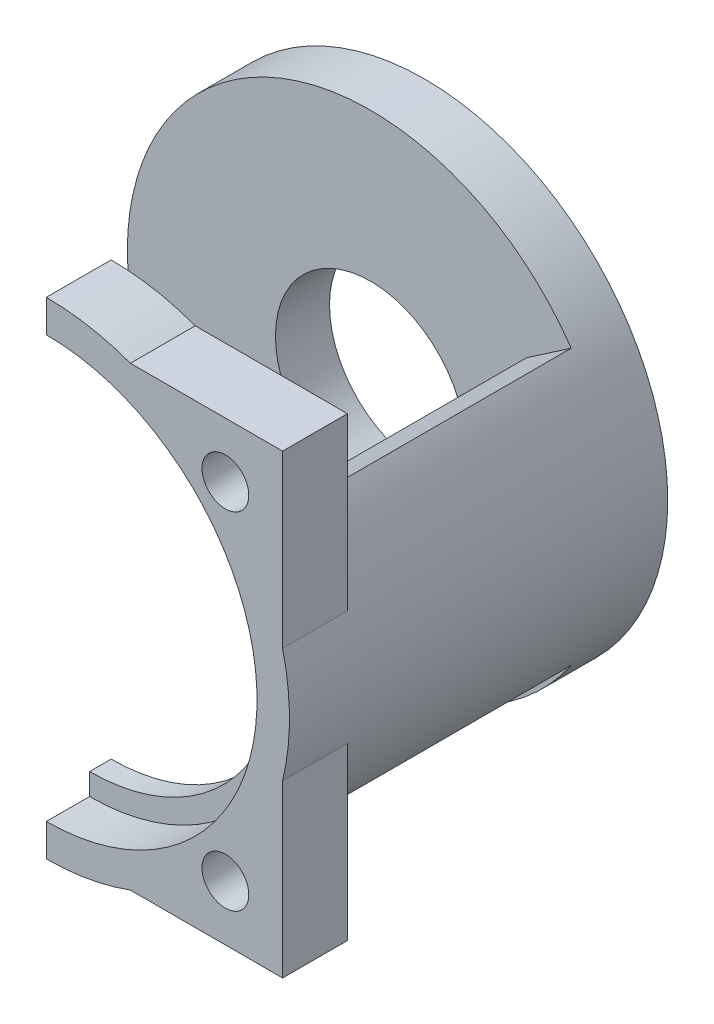
ISO-10303-21;
HEADER;
FILE_DESCRIPTION(('STEP AP214'),'2;1');
FILE_NAME('part.step','',(''),(''),'','','');
FILE_SCHEMA(('AUTOMOTIVE_DESIGN { 1 0 10303 214 1 1 1 1 }'));
ENDSEC;
DATA;
#1=APPLICATION_CONTEXT('core data for automotive mechanical design processes');
#2=APPLICATION_PROTOCOL_DEFINITION('international standard','automotive_design',2000,#1);
#3=PRODUCT_CONTEXT('',#1,'mechanical');
#4=PRODUCT('Part','Part','',(#3));
#5=PRODUCT_RELATED_PRODUCT_CATEGORY('part','',(#4));
#6=PRODUCT_DEFINITION_FORMATION('','',#4);
#7=PRODUCT_DEFINITION_CONTEXT('part definition',#1,'design');
#8=PRODUCT_DEFINITION('design','',#6,#7);
#9=PRODUCT_DEFINITION_SHAPE('','',#8);
#10=(LENGTH_UNIT() NAMED_UNIT(*) SI_UNIT(.MILLI.,.METRE.));
#11=(NAMED_UNIT(*) PLANE_ANGLE_UNIT() SI_UNIT($,.RADIAN.));
#12=(NAMED_UNIT(*) SI_UNIT($,.STERADIAN.) SOLID_ANGLE_UNIT());
#13=UNCERTAINTY_MEASURE_WITH_UNIT(LENGTH_MEASURE(1.E-05),#10,'distance_accuracy_value','');
#14=(GEOMETRIC_REPRESENTATION_CONTEXT(3) GLOBAL_UNCERTAINTY_ASSIGNED_CONTEXT((#13)) GLOBAL_UNIT_ASSIGNED_CONTEXT((#10,
#11,#12)) REPRESENTATION_CONTEXT('',''));
#15=CARTESIAN_POINT('',(0.,0.,0.));
#16=DIRECTION('',(0.,0.,1.));
#17=DIRECTION('',(1.,0.,0.));
#18=AXIS2_PLACEMENT_3D('',#15,#16,#17);
#19=CARTESIAN_POINT('',(0.,0.,0.));
#20=DIRECTION('',(0.,0.,1.));
#21=DIRECTION('',(1.,0.,0.));
#22=AXIS2_PLACEMENT_3D('',#19,#20,#21);
#23=PLANE('',#22);
#24=CARTESIAN_POINT('',(16.5717156908569,-16.,0.));
#25=DIRECTION('',(0.,0.,-1.));
#26=DIRECTION('',(-1.,0.,0.));
#27=AXIS2_PLACEMENT_3D('',#24,#25,#26);
#28=CIRCLE('',#27,2.165);
#29=CARTESIAN_POINT('',(14.4067156908569,-16.,0.));
#30=VERTEX_POINT('',#29);
#31=EDGE_CURVE('E286',#30,#30,#28,.T.);
#32=ORIENTED_EDGE('',*,*,#31,.F.);
#33=EDGE_LOOP('',(#32));
#34=FACE_BOUND('',#33,.T.);
#35=CARTESIAN_POINT('',(0.,0.,0.));
#36=DIRECTION('',(0.,0.,1.));
#37=DIRECTION('',(1.,0.,0.));
#38=AXIS2_PLACEMENT_3D('',#35,#36,#37);
#39=CIRCLE('',#38,22.4995417);
#40=CARTESIAN_POINT('',(0.,-22.4995417,0.));
#41=VERTEX_POINT('',#40);
#42=CARTESIAN_POINT('',(7.78357654700596,-21.11031295,0.));
#43=VERTEX_POINT('',#42);
#44=EDGE_CURVE('E174',#41,#43,#39,.T.);
#45=ORIENTED_EDGE('',*,*,#44,.F.);
#46=DIRECTION('',(0.,-1.,0.));
#47=VECTOR('',#46,1.);
#48=CARTESIAN_POINT('',(0.,20.4250061284432,0.));
#49=LINE('',#48,#47);
#50=CARTESIAN_POINT('',(0.,-17.4995417,0.));
#51=VERTEX_POINT('',#50);
#52=EDGE_CURVE('E167',#51,#41,#49,.T.);
#53=ORIENTED_EDGE('',*,*,#52,.F.);
#54=CARTESIAN_POINT('',(0.,0.,0.));
#55=DIRECTION('',(0.,0.,1.));
#56=DIRECTION('',(1.,0.,0.));
#57=AXIS2_PLACEMENT_3D('',#54,#55,#56);
#58=CIRCLE('',#57,17.4995417);
#59=CARTESIAN_POINT('',(14.4415275194375,-9.88312919147412,0.));
#60=VERTEX_POINT('',#59);
#61=EDGE_CURVE('E181',#51,#60,#58,.T.);
#62=ORIENTED_EDGE('',*,*,#61,.T.);
#63=DIRECTION('',(-0.82525175613242,0.564765029902133,0.));
#64=VECTOR('',#63,1.);
#65=CARTESIAN_POINT('',(14.4415275194375,-9.88312919147412,0.));
#66=LINE('',#65,#64);
#67=CARTESIAN_POINT('',(18.5677863000996,-12.7069543409848,0.));
#68=VERTEX_POINT('',#67);
#69=EDGE_CURVE('E244',#68,#60,#66,.T.);
#70=ORIENTED_EDGE('',*,*,#69,.F.);
#71=CARTESIAN_POINT('',(0.,0.,0.));
#72=DIRECTION('',(0.,0.,-1.));
#73=DIRECTION('',(-1.,0.,0.));
#74=AXIS2_PLACEMENT_3D('',#71,#72,#73);
#75=CIRCLE('',#74,22.4995417);
#76=CARTESIAN_POINT('',(21.8646315220259,-5.30728415633356,0.));
#77=VERTEX_POINT('',#76);
#78=EDGE_CURVE('E179',#77,#68,#75,.T.);
#79=ORIENTED_EDGE('',*,*,#78,.F.);
#80=DIRECTION('',(0.,-1.,0.));
#81=VECTOR('',#80,1.);
#82=CARTESIAN_POINT('',(21.8646315220259,-21.11031295,0.));
#83=LINE('',#82,#81);
#84=CARTESIAN_POINT('',(21.8646315220259,-21.11031295,0.));
#85=VERTEX_POINT('',#84);
#86=EDGE_CURVE('E216',#77,#85,#83,.T.);
#87=ORIENTED_EDGE('',*,*,#86,.T.);
#88=DIRECTION('',(-1.,0.,0.));
#89=VECTOR('',#88,1.);
#90=CARTESIAN_POINT('',(7.78357654700597,-21.11031295,0.));
#91=LINE('',#90,#89);
#92=EDGE_CURVE('E220',#85,#43,#91,.T.);
#93=ORIENTED_EDGE('',*,*,#92,.T.);
#94=EDGE_LOOP('',(#45,#53,#62,#70,#79,#87,#93));
#95=FACE_BOUND('',#94,.T.);
#96=ADVANCED_FACE('F36',(#34,#95),#23,.F.);
#97=CARTESIAN_POINT('',(16.5717156908569,16.,0.));
#98=DIRECTION('',(0.,0.,-1.));
#99=DIRECTION('',(-1.,0.,0.));
#100=AXIS2_PLACEMENT_3D('',#97,#98,#99);
#101=CIRCLE('',#100,2.165);
#102=CARTESIAN_POINT('',(14.4067156908569,16.,0.));
#103=VERTEX_POINT('',#102);
#104=EDGE_CURVE('E280',#103,#103,#101,.T.);
#105=ORIENTED_EDGE('',*,*,#104,.F.);
#106=EDGE_LOOP('',(#105));
#107=FACE_BOUND('',#106,.T.);
#108=CARTESIAN_POINT('',(14.4415275194375,9.88312919147413,0.));
#109=VERTEX_POINT('',#108);
#110=CARTESIAN_POINT('',(0.,17.4995417,0.));
#111=VERTEX_POINT('',#110);
#112=EDGE_CURVE('E165',#109,#111,#58,.T.);
#113=ORIENTED_EDGE('',*,*,#112,.T.);
#114=CARTESIAN_POINT('',(0.,22.4995417,0.));
#115=VERTEX_POINT('',#114);
#116=EDGE_CURVE('E149',#115,#111,#49,.T.);
#117=ORIENTED_EDGE('',*,*,#116,.F.);
#118=CARTESIAN_POINT('',(7.78357654700599,21.11031295,0.));
#119=VERTEX_POINT('',#118);
#120=EDGE_CURVE('E162',#119,#115,#39,.T.);
#121=ORIENTED_EDGE('',*,*,#120,.F.);
#122=DIRECTION('',(1.,0.,0.));
#123=VECTOR('',#122,1.);
#124=CARTESIAN_POINT('',(7.78357654700599,21.11031295,0.));
#125=LINE('',#124,#123);
#126=CARTESIAN_POINT('',(21.8646315220259,21.11031295,0.));
#127=VERTEX_POINT('',#126);
#128=EDGE_CURVE('E197',#119,#127,#125,.T.);
#129=ORIENTED_EDGE('',*,*,#128,.T.);
#130=DIRECTION('',(0.,-1.,0.));
#131=VECTOR('',#130,1.);
#132=CARTESIAN_POINT('',(21.8646315220259,5.30728415633356,0.));
#133=LINE('',#132,#131);
#134=CARTESIAN_POINT('',(21.8646315220259,5.30728415633356,0.));
#135=VERTEX_POINT('',#134);
#136=EDGE_CURVE('E200',#127,#135,#133,.T.);
#137=ORIENTED_EDGE('',*,*,#136,.T.);
#138=CARTESIAN_POINT('',(18.5677863000996,12.7069543409848,0.));
#139=VERTEX_POINT('',#138);
#140=EDGE_CURVE('E247',#139,#135,#75,.T.);
#141=ORIENTED_EDGE('',*,*,#140,.F.);
#142=DIRECTION('',(0.82525175613242,0.564765029902133,0.));
#143=VECTOR('',#142,1.);
#144=CARTESIAN_POINT('',(14.4415275194375,9.88312919147413,0.));
#145=LINE('',#144,#143);
#146=EDGE_CURVE('E240',#109,#139,#145,.T.);
#147=ORIENTED_EDGE('',*,*,#146,.F.);
#148=EDGE_LOOP('',(#113,#117,#121,#129,#137,#141,#147));
#149=FACE_BOUND('',#148,.T.);
#150=ADVANCED_FACE('F160',(#107,#149),#23,.F.);
#151=CARTESIAN_POINT('',(0.,0.,6.));
#152=DIRECTION('',(0.,0.,-1.));
#153=DIRECTION('',(-1.,0.,0.));
#154=AXIS2_PLACEMENT_3D('',#151,#152,#153);
#155=CYLINDRICAL_SURFACE('',#154,22.4995417);
#156=CARTESIAN_POINT('',(0.,0.,6.));
#157=DIRECTION('',(0.,0.,1.));
#158=DIRECTION('',(1.,0.,0.));
#159=AXIS2_PLACEMENT_3D('',#156,#157,#158);
#160=CIRCLE('',#159,22.4995417);
#161=CARTESIAN_POINT('',(0.,-22.4995417,6.));
#162=VERTEX_POINT('',#161);
#163=CARTESIAN_POINT('',(7.78357654700596,-21.11031295,6.));
#164=VERTEX_POINT('',#163);
#165=EDGE_CURVE('E175',#162,#164,#160,.T.);
#166=ORIENTED_EDGE('',*,*,#165,.F.);
#167=DIRECTION('',(0.,0.,-1.));
#168=VECTOR('',#167,1.);
#169=CARTESIAN_POINT('',(0.,-22.4995417,6.));
#170=LINE('',#169,#168);
#171=EDGE_CURVE('E155',#162,#41,#170,.T.);
#172=ORIENTED_EDGE('',*,*,#171,.T.);
#173=ORIENTED_EDGE('',*,*,#44,.T.);
#174=DIRECTION('',(0.,0.,-1.));
#175=VECTOR('',#174,1.);
#176=CARTESIAN_POINT('',(7.78357654700597,-21.11031295,6.));
#177=LINE('',#176,#175);
#178=EDGE_CURVE('E208',#164,#43,#177,.T.);
#179=ORIENTED_EDGE('',*,*,#178,.F.);
#180=EDGE_LOOP('',(#166,#172,#173,#179));
#181=FACE_BOUND('',#180,.T.);
#182=ADVANCED_FACE('F312',(#181),#155,.T.);
#183=ORIENTED_EDGE('',*,*,#120,.T.);
#184=DIRECTION('',(0.,0.,-1.));
#185=VECTOR('',#184,1.);
#186=CARTESIAN_POINT('',(0.,22.4995417,6.));
#187=LINE('',#186,#185);
#188=CARTESIAN_POINT('',(0.,22.4995417,6.));
#189=VERTEX_POINT('',#188);
#190=EDGE_CURVE('E146',#115,#189,#187,.F.);
#191=ORIENTED_EDGE('',*,*,#190,.T.);
#192=CARTESIAN_POINT('',(7.78357654700599,21.11031295,6.));
#193=VERTEX_POINT('',#192);
#194=EDGE_CURVE('E177',#193,#189,#160,.T.);
#195=ORIENTED_EDGE('',*,*,#194,.F.);
#196=DIRECTION('',(0.,0.,-1.));
#197=VECTOR('',#196,1.);
#198=CARTESIAN_POINT('',(7.78357654700599,21.11031295,6.));
#199=LINE('',#198,#197);
#200=EDGE_CURVE('E171',#193,#119,#199,.T.);
#201=ORIENTED_EDGE('',*,*,#200,.T.);
#202=EDGE_LOOP('',(#183,#191,#195,#201));
#203=FACE_BOUND('',#202,.T.);
#204=ADVANCED_FACE('F169',(#203),#155,.T.);
#205=CARTESIAN_POINT('',(0.,0.,6.));
#206=DIRECTION('',(0.,0.,-1.));
#207=DIRECTION('',(-1.,0.,0.));
#208=AXIS2_PLACEMENT_3D('',#205,#206,#207);
#209=CYLINDRICAL_SURFACE('',#208,17.4995417);
#210=DIRECTION('',(0.,0.,-1.));
#211=VECTOR('',#210,1.);
#212=CARTESIAN_POINT('',(0.,-17.4995417,6.));
#213=LINE('',#212,#211);
#214=CARTESIAN_POINT('',(0.,-17.4995417,2.));
#215=VERTEX_POINT('',#214);
#216=EDGE_CURVE('E156',#215,#51,#213,.T.);
#217=ORIENTED_EDGE('',*,*,#216,.F.);
#218=CARTESIAN_POINT('',(0.,0.,2.));
#219=DIRECTION('',(0.,0.,1.));
#220=DIRECTION('',(1.,0.,0.));
#221=AXIS2_PLACEMENT_3D('',#218,#219,#220);
#222=CIRCLE('',#221,17.4995417);
#223=CARTESIAN_POINT('',(0.,17.4995417,2.));
#224=VERTEX_POINT('',#223);
#225=EDGE_CURVE('E186',#215,#224,#222,.T.);
#226=ORIENTED_EDGE('',*,*,#225,.T.);
#227=DIRECTION('',(0.,0.,-1.));
#228=VECTOR('',#227,1.);
#229=CARTESIAN_POINT('',(0.,17.4995417,6.));
#230=LINE('',#229,#228);
#231=EDGE_CURVE('E58',#111,#224,#230,.F.);
#232=ORIENTED_EDGE('',*,*,#231,.F.);
#233=ORIENTED_EDGE('',*,*,#112,.F.);
#234=DIRECTION('',(0.,0.,1.));
#235=VECTOR('',#234,1.);
#236=CARTESIAN_POINT('',(14.4415275194375,9.88312919147412,-24.));
#237=LINE('',#236,#235);
#238=CARTESIAN_POINT('',(14.4415275194375,9.88312919147412,-24.));
#239=VERTEX_POINT('',#238);
#240=EDGE_CURVE('E233',#239,#109,#237,.T.);
#241=ORIENTED_EDGE('',*,*,#240,.F.);
#242=CARTESIAN_POINT('',(0.,0.,-24.));
#243=DIRECTION('',(0.,0.,1.));
#244=DIRECTION('',(-1.,0.,0.));
#245=AXIS2_PLACEMENT_3D('',#242,#243,#244);
#246=CIRCLE('',#245,17.4995417);
#247=CARTESIAN_POINT('',(14.4415275194375,-9.88312919147412,-24.));
#248=VERTEX_POINT('',#247);
#249=EDGE_CURVE('E253',#248,#239,#246,.T.);
#250=ORIENTED_EDGE('',*,*,#249,.F.);
#251=DIRECTION('',(0.,0.,1.));
#252=VECTOR('',#251,1.);
#253=CARTESIAN_POINT('',(14.4415275194375,-9.88312919147412,-24.));
#254=LINE('',#253,#252);
#255=EDGE_CURVE('E230',#248,#60,#254,.T.);
#256=ORIENTED_EDGE('',*,*,#255,.T.);
#257=ORIENTED_EDGE('',*,*,#61,.F.);
#258=EDGE_LOOP('',(#217,#226,#232,#233,#241,#250,#256,#257));
#259=FACE_BOUND('',#258,.T.);
#260=ADVANCED_FACE('F341',(#259),#209,.F.);
#261=CARTESIAN_POINT('',(0.,0.,6.));
#262=DIRECTION('',(0.,0.,1.));
#263=DIRECTION('',(1.,0.,0.));
#264=AXIS2_PLACEMENT_3D('',#261,#262,#263);
#265=PLANE('',#264);
#266=CARTESIAN_POINT('',(16.5717156908569,16.,6.));
#267=DIRECTION('',(0.,0.,-1.));
#268=DIRECTION('',(-1.,0.,0.));
#269=AXIS2_PLACEMENT_3D('',#266,#267,#268);
#270=CIRCLE('',#269,2.165);
#271=CARTESIAN_POINT('',(14.4067156908569,16.,6.));
#272=VERTEX_POINT('',#271);
#273=EDGE_CURVE('E283',#272,#272,#270,.T.);
#274=ORIENTED_EDGE('',*,*,#273,.T.);
#275=EDGE_LOOP('',(#274));
#276=FACE_BOUND('',#275,.T.);
#277=CARTESIAN_POINT('',(16.5717156908569,-16.,6.));
#278=DIRECTION('',(0.,0.,-1.));
#279=DIRECTION('',(-1.,0.,0.));
#280=AXIS2_PLACEMENT_3D('',#277,#278,#279);
#281=CIRCLE('',#280,2.165);
#282=CARTESIAN_POINT('',(14.4067156908569,-16.,6.));
#283=VERTEX_POINT('',#282);
#284=EDGE_CURVE('E277',#283,#283,#281,.T.);
#285=ORIENTED_EDGE('',*,*,#284,.T.);
#286=EDGE_LOOP('',(#285));
#287=FACE_BOUND('',#286,.T.);
#288=DIRECTION('',(0.,-1.,0.));
#289=VECTOR('',#288,1.);
#290=CARTESIAN_POINT('',(0.,20.4250061284432,6.));
#291=LINE('',#290,#289);
#292=CARTESIAN_POINT('',(0.,-19.4995417,6.));
#293=VERTEX_POINT('',#292);
#294=EDGE_CURVE('E166',#293,#162,#291,.T.);
#295=ORIENTED_EDGE('',*,*,#294,.T.);
#296=ORIENTED_EDGE('',*,*,#165,.T.);
#297=DIRECTION('',(-1.,0.,0.));
#298=VECTOR('',#297,1.);
#299=CARTESIAN_POINT('',(7.78357654700597,-21.11031295,6.));
#300=LINE('',#299,#298);
#301=CARTESIAN_POINT('',(21.8646315220259,-21.11031295,6.));
#302=VERTEX_POINT('',#301);
#303=EDGE_CURVE('E219',#302,#164,#300,.T.);
#304=ORIENTED_EDGE('',*,*,#303,.F.);
#305=DIRECTION('',(0.,-1.,0.));
#306=VECTOR('',#305,1.);
#307=CARTESIAN_POINT('',(21.8646315220259,-21.11031295,6.));
#308=LINE('',#307,#306);
#309=CARTESIAN_POINT('',(21.8646315220259,-5.30728415633356,6.));
#310=VERTEX_POINT('',#309);
#311=EDGE_CURVE('E212',#310,#302,#308,.T.);
#312=ORIENTED_EDGE('',*,*,#311,.F.);
#313=CARTESIAN_POINT('',(21.8646315220259,5.30728415633356,6.));
#314=VERTEX_POINT('',#313);
#315=EDGE_CURVE('E173',#310,#314,#160,.T.);
#316=ORIENTED_EDGE('',*,*,#315,.T.);
#317=DIRECTION('',(0.,-1.,0.));
#318=VECTOR('',#317,1.);
#319=CARTESIAN_POINT('',(21.8646315220259,5.30728415633356,6.));
#320=LINE('',#319,#318);
#321=CARTESIAN_POINT('',(21.8646315220259,21.11031295,6.));
#322=VERTEX_POINT('',#321);
#323=EDGE_CURVE('E199',#322,#314,#320,.T.);
#324=ORIENTED_EDGE('',*,*,#323,.F.);
#325=DIRECTION('',(1.,0.,0.));
#326=VECTOR('',#325,1.);
#327=CARTESIAN_POINT('',(7.78357654700599,21.11031295,6.));
#328=LINE('',#327,#326);
#329=EDGE_CURVE('E194',#193,#322,#328,.T.);
#330=ORIENTED_EDGE('',*,*,#329,.F.);
#331=ORIENTED_EDGE('',*,*,#194,.T.);
#332=CARTESIAN_POINT('',(0.,19.4995417,6.));
#333=VERTEX_POINT('',#332);
#334=EDGE_CURVE('E151',#189,#333,#291,.T.);
#335=ORIENTED_EDGE('',*,*,#334,.T.);
#336=CARTESIAN_POINT('',(0.,0.,6.));
#337=DIRECTION('',(0.,0.,1.));
#338=DIRECTION('',(1.,0.,0.));
#339=AXIS2_PLACEMENT_3D('',#336,#337,#338);
#340=CIRCLE('',#339,19.4995417);
#341=EDGE_CURVE('E182',#293,#333,#340,.T.);
#342=ORIENTED_EDGE('',*,*,#341,.F.);
#343=EDGE_LOOP('',(#295,#296,#304,#312,#316,#324,#330,#331,#335,#342));
#344=FACE_BOUND('',#343,.T.);
#345=ADVANCED_FACE('F292',(#276,#287,#344),#265,.T.);
#346=ORIENTED_EDGE('',*,*,#315,.F.);
#347=DIRECTION('',(0.,0.,-1.));
#348=VECTOR('',#347,1.);
#349=CARTESIAN_POINT('',(21.8646315220259,-5.30728415633356,6.));
#350=LINE('',#349,#348);
#351=EDGE_CURVE('E211',#310,#77,#350,.T.);
#352=ORIENTED_EDGE('',*,*,#351,.T.);
#353=ORIENTED_EDGE('',*,*,#78,.T.);
#354=DIRECTION('',(0.,0.,1.));
#355=VECTOR('',#354,1.);
#356=CARTESIAN_POINT('',(18.5677863000996,-12.7069543409848,-24.));
#357=LINE('',#356,#355);
#358=CARTESIAN_POINT('',(18.5677863000996,-12.7069543409848,-24.));
#359=VERTEX_POINT('',#358);
#360=EDGE_CURVE('E223',#359,#68,#357,.T.);
#361=ORIENTED_EDGE('',*,*,#360,.F.);
#362=CARTESIAN_POINT('',(0.,0.,-24.));
#363=DIRECTION('',(0.,0.,-1.));
#364=DIRECTION('',(-1.,0.,0.));
#365=AXIS2_PLACEMENT_3D('',#362,#363,#364);
#366=CIRCLE('',#365,22.4995417);
#367=CARTESIAN_POINT('',(18.5677863000996,12.7069543409848,-24.));
#368=VERTEX_POINT('',#367);
#369=EDGE_CURVE('E258',#359,#368,#366,.T.);
#370=ORIENTED_EDGE('',*,*,#369,.T.);
#371=DIRECTION('',(0.,0.,1.));
#372=VECTOR('',#371,1.);
#373=CARTESIAN_POINT('',(18.5677863000996,12.7069543409848,-24.));
#374=LINE('',#373,#372);
#375=EDGE_CURVE('E236',#368,#139,#374,.T.);
#376=ORIENTED_EDGE('',*,*,#375,.T.);
#377=ORIENTED_EDGE('',*,*,#140,.T.);
#378=DIRECTION('',(0.,0.,-1.));
#379=VECTOR('',#378,1.);
#380=CARTESIAN_POINT('',(21.8646315220259,5.30728415633356,6.));
#381=LINE('',#380,#379);
#382=EDGE_CURVE('E192',#314,#135,#381,.T.);
#383=ORIENTED_EDGE('',*,*,#382,.F.);
#384=EDGE_LOOP('',(#346,#352,#353,#361,#370,#376,#377,#383));
#385=FACE_BOUND('',#384,.T.);
#386=CARTESIAN_POINT('',(0.,0.,-29.));
#387=DIRECTION('',(0.,0.,-1.));
#388=DIRECTION('',(-1.,0.,0.));
#389=AXIS2_PLACEMENT_3D('',#386,#387,#388);
#390=CIRCLE('',#389,22.4995417);
#391=CARTESIAN_POINT('',(-22.4995417,0.,-29.));
#392=VERTEX_POINT('',#391);
#393=EDGE_CURVE('E250',#392,#392,#390,.T.);
#394=ORIENTED_EDGE('',*,*,#393,.F.);
#395=EDGE_LOOP('',(#394));
#396=FACE_BOUND('',#395,.T.);
#397=ADVANCED_FACE('F38',(#385,#396),#155,.T.);
#398=CARTESIAN_POINT('',(0.,0.,2.));
#399=DIRECTION('',(0.,0.,1.));
#400=DIRECTION('',(1.,0.,0.));
#401=AXIS2_PLACEMENT_3D('',#398,#399,#400);
#402=CYLINDRICAL_SURFACE('',#401,19.4995417);
#403=ORIENTED_EDGE('',*,*,#341,.T.);
#404=DIRECTION('',(0.,0.,1.));
#405=VECTOR('',#404,1.);
#406=CARTESIAN_POINT('',(0.,19.4995417,2.));
#407=LINE('',#406,#405);
#408=CARTESIAN_POINT('',(0.,19.4995417,2.));
#409=VERTEX_POINT('',#408);
#410=EDGE_CURVE('E274',#333,#409,#407,.F.);
#411=ORIENTED_EDGE('',*,*,#410,.T.);
#412=CARTESIAN_POINT('',(0.,0.,2.));
#413=DIRECTION('',(0.,0.,1.));
#414=DIRECTION('',(1.,0.,0.));
#415=AXIS2_PLACEMENT_3D('',#412,#413,#414);
#416=CIRCLE('',#415,19.4995417);
#417=CARTESIAN_POINT('',(0.,-19.4995417,2.));
#418=VERTEX_POINT('',#417);
#419=EDGE_CURVE('E185',#418,#409,#416,.T.);
#420=ORIENTED_EDGE('',*,*,#419,.F.);
#421=DIRECTION('',(0.,0.,1.));
#422=VECTOR('',#421,1.);
#423=CARTESIAN_POINT('',(0.,-19.4995417,2.));
#424=LINE('',#423,#422);
#425=EDGE_CURVE('E50',#418,#293,#424,.T.);
#426=ORIENTED_EDGE('',*,*,#425,.T.);
#427=EDGE_LOOP('',(#403,#411,#420,#426));
#428=FACE_BOUND('',#427,.T.);
#429=ADVANCED_FACE('F347',(#428),#402,.F.);
#430=CARTESIAN_POINT('',(0.,0.,2.));
#431=DIRECTION('',(0.,0.,1.));
#432=DIRECTION('',(1.,0.,0.));
#433=AXIS2_PLACEMENT_3D('',#430,#431,#432);
#434=PLANE('',#433);
#435=DIRECTION('',(0.,1.,0.));
#436=VECTOR('',#435,1.);
#437=CARTESIAN_POINT('',(0.,0.,2.));
#438=LINE('',#437,#436);
#439=EDGE_CURVE('E11',#418,#215,#438,.T.);
#440=ORIENTED_EDGE('',*,*,#439,.F.);
#441=ORIENTED_EDGE('',*,*,#419,.T.);
#442=EDGE_CURVE('E40',#224,#409,#438,.T.);
#443=ORIENTED_EDGE('',*,*,#442,.F.);
#444=ORIENTED_EDGE('',*,*,#225,.F.);
#445=EDGE_LOOP('',(#440,#441,#443,#444));
#446=FACE_BOUND('',#445,.T.);
#447=ADVANCED_FACE('F344',(#446),#434,.T.);
#448=CARTESIAN_POINT('',(21.8646315220259,5.30728415633356,6.));
#449=DIRECTION('',(1.,0.,0.));
#450=DIRECTION('',(0.,1.,0.));
#451=AXIS2_PLACEMENT_3D('',#448,#449,#450);
#452=PLANE('',#451);
#453=ORIENTED_EDGE('',*,*,#136,.F.);
#454=DIRECTION('',(0.,0.,-1.));
#455=VECTOR('',#454,1.);
#456=CARTESIAN_POINT('',(21.8646315220259,21.11031295,6.));
#457=LINE('',#456,#455);
#458=EDGE_CURVE('E191',#322,#127,#457,.T.);
#459=ORIENTED_EDGE('',*,*,#458,.F.);
#460=ORIENTED_EDGE('',*,*,#323,.T.);
#461=ORIENTED_EDGE('',*,*,#382,.T.);
#462=EDGE_LOOP('',(#453,#459,#460,#461));
#463=FACE_BOUND('',#462,.T.);
#464=ADVANCED_FACE('F379',(#463),#452,.T.);
#465=CARTESIAN_POINT('',(7.78357654700599,21.11031295,6.));
#466=DIRECTION('',(0.,1.,0.));
#467=DIRECTION('',(0.,0.,1.));
#468=AXIS2_PLACEMENT_3D('',#465,#466,#467);
#469=PLANE('',#468);
#470=ORIENTED_EDGE('',*,*,#128,.F.);
#471=ORIENTED_EDGE('',*,*,#200,.F.);
#472=ORIENTED_EDGE('',*,*,#329,.T.);
#473=ORIENTED_EDGE('',*,*,#458,.T.);
#474=EDGE_LOOP('',(#470,#471,#472,#473));
#475=FACE_BOUND('',#474,.T.);
#476=ADVANCED_FACE('F330',(#475),#469,.T.);
#477=CARTESIAN_POINT('',(7.78357654700597,-21.11031295,6.));
#478=DIRECTION('',(0.,-1.,0.));
#479=DIRECTION('',(0.,0.,-1.));
#480=AXIS2_PLACEMENT_3D('',#477,#478,#479);
#481=PLANE('',#480);
#482=ORIENTED_EDGE('',*,*,#92,.F.);
#483=DIRECTION('',(0.,0.,-1.));
#484=VECTOR('',#483,1.);
#485=CARTESIAN_POINT('',(21.8646315220259,-21.11031295,6.));
#486=LINE('',#485,#484);
#487=EDGE_CURVE('E203',#302,#85,#486,.T.);
#488=ORIENTED_EDGE('',*,*,#487,.F.);
#489=ORIENTED_EDGE('',*,*,#303,.T.);
#490=ORIENTED_EDGE('',*,*,#178,.T.);
#491=EDGE_LOOP('',(#482,#488,#489,#490));
#492=FACE_BOUND('',#491,.T.);
#493=ADVANCED_FACE('F314',(#492),#481,.T.);
#494=CARTESIAN_POINT('',(21.8646315220259,-21.11031295,6.));
#495=DIRECTION('',(1.,0.,0.));
#496=DIRECTION('',(0.,1.,0.));
#497=AXIS2_PLACEMENT_3D('',#494,#495,#496);
#498=PLANE('',#497);
#499=ORIENTED_EDGE('',*,*,#86,.F.);
#500=ORIENTED_EDGE('',*,*,#351,.F.);
#501=ORIENTED_EDGE('',*,*,#311,.T.);
#502=ORIENTED_EDGE('',*,*,#487,.T.);
#503=EDGE_LOOP('',(#499,#500,#501,#502));
#504=FACE_BOUND('',#503,.T.);
#505=ADVANCED_FACE('F320',(#504),#498,.T.);
#506=CARTESIAN_POINT('',(14.4415275194375,-9.88312919147412,-24.));
#507=DIRECTION('',(0.564765029902133,0.82525175613242,0.));
#508=DIRECTION('',(-0.82525175613242,0.564765029902133,0.));
#509=AXIS2_PLACEMENT_3D('',#506,#507,#508);
#510=PLANE('',#509);
#511=ORIENTED_EDGE('',*,*,#69,.T.);
#512=ORIENTED_EDGE('',*,*,#255,.F.);
#513=DIRECTION('',(-0.82525175613242,0.564765029902133,0.));
#514=VECTOR('',#513,1.);
#515=CARTESIAN_POINT('',(14.4415275194375,-9.88312919147412,-24.));
#516=LINE('',#515,#514);
#517=EDGE_CURVE('E243',#359,#248,#516,.T.);
#518=ORIENTED_EDGE('',*,*,#517,.F.);
#519=ORIENTED_EDGE('',*,*,#360,.T.);
#520=EDGE_LOOP('',(#511,#512,#518,#519));
#521=FACE_BOUND('',#520,.T.);
#522=ADVANCED_FACE('F369',(#521),#510,.F.);
#523=CARTESIAN_POINT('',(14.4415275194375,9.88312919147413,-24.));
#524=DIRECTION('',(0.564765029902133,-0.82525175613242,0.));
#525=DIRECTION('',(0.82525175613242,0.564765029902133,0.));
#526=AXIS2_PLACEMENT_3D('',#523,#524,#525);
#527=PLANE('',#526);
#528=ORIENTED_EDGE('',*,*,#146,.T.);
#529=ORIENTED_EDGE('',*,*,#375,.F.);
#530=DIRECTION('',(0.82525175613242,0.564765029902133,0.));
#531=VECTOR('',#530,1.);
#532=CARTESIAN_POINT('',(14.4415275194375,9.88312919147413,-24.));
#533=LINE('',#532,#531);
#534=EDGE_CURVE('E239',#239,#368,#533,.T.);
#535=ORIENTED_EDGE('',*,*,#534,.F.);
#536=ORIENTED_EDGE('',*,*,#240,.T.);
#537=EDGE_LOOP('',(#528,#529,#535,#536));
#538=FACE_BOUND('',#537,.T.);
#539=ADVANCED_FACE('F335',(#538),#527,.F.);
#540=CARTESIAN_POINT('',(0.,0.,-24.));
#541=DIRECTION('',(0.,0.,-1.));
#542=DIRECTION('',(-1.,0.,0.));
#543=AXIS2_PLACEMENT_3D('',#540,#541,#542);
#544=PLANE('',#543);
#545=CARTESIAN_POINT('',(0.,0.,-24.));
#546=DIRECTION('',(0.,0.,-1.));
#547=DIRECTION('',(-1.,0.,0.));
#548=AXIS2_PLACEMENT_3D('',#545,#546,#547);
#549=CIRCLE('',#548,8.79453705);
#550=CARTESIAN_POINT('',(-8.79453705,0.,-24.));
#551=VERTEX_POINT('',#550);
#552=EDGE_CURVE('E264',#551,#551,#549,.T.);
#553=ORIENTED_EDGE('',*,*,#552,.T.);
#554=EDGE_LOOP('',(#553));
#555=FACE_BOUND('',#554,.T.);
#556=ORIENTED_EDGE('',*,*,#369,.F.);
#557=ORIENTED_EDGE('',*,*,#517,.T.);
#558=ORIENTED_EDGE('',*,*,#249,.T.);
#559=ORIENTED_EDGE('',*,*,#534,.T.);
#560=EDGE_LOOP('',(#556,#557,#558,#559));
#561=FACE_BOUND('',#560,.T.);
#562=ADVANCED_FACE('F337',(#555,#561),#544,.F.);
#563=CARTESIAN_POINT('',(0.,0.,-29.));
#564=DIRECTION('',(0.,0.,-1.));
#565=DIRECTION('',(-1.,0.,0.));
#566=AXIS2_PLACEMENT_3D('',#563,#564,#565);
#567=PLANE('',#566);
#568=ORIENTED_EDGE('',*,*,#393,.T.);
#569=EDGE_LOOP('',(#568));
#570=FACE_BOUND('',#569,.T.);
#571=CARTESIAN_POINT('',(0.,0.,-29.));
#572=DIRECTION('',(0.,0.,-1.));
#573=DIRECTION('',(-1.,0.,0.));
#574=AXIS2_PLACEMENT_3D('',#571,#572,#573);
#575=CIRCLE('',#574,8.79453705);
#576=CARTESIAN_POINT('',(-8.79453705,0.,-29.));
#577=VERTEX_POINT('',#576);
#578=EDGE_CURVE('E261',#577,#577,#575,.T.);
#579=ORIENTED_EDGE('',*,*,#578,.F.);
#580=EDGE_LOOP('',(#579));
#581=FACE_BOUND('',#580,.T.);
#582=ADVANCED_FACE('F359',(#570,#581),#567,.T.);
#583=CARTESIAN_POINT('',(0.,0.,-29.));
#584=DIRECTION('',(0.,0.,1.));
#585=DIRECTION('',(1.,0.,0.));
#586=AXIS2_PLACEMENT_3D('',#583,#584,#585);
#587=CYLINDRICAL_SURFACE('',#586,8.79453705);
#588=ORIENTED_EDGE('',*,*,#578,.T.);
#589=EDGE_LOOP('',(#588));
#590=FACE_BOUND('',#589,.T.);
#591=ORIENTED_EDGE('',*,*,#552,.F.);
#592=EDGE_LOOP('',(#591));
#593=FACE_BOUND('',#592,.T.);
#594=ADVANCED_FACE('F354',(#590,#593),#587,.F.);
#595=CARTESIAN_POINT('',(0.,20.4250061284432,6.));
#596=DIRECTION('',(1.,0.,0.));
#597=DIRECTION('',(0.,0.,-1.));
#598=AXIS2_PLACEMENT_3D('',#595,#596,#597);
#599=PLANE('',#598);
#600=ORIENTED_EDGE('',*,*,#116,.T.);
#601=ORIENTED_EDGE('',*,*,#231,.T.);
#602=ORIENTED_EDGE('',*,*,#442,.T.);
#603=ORIENTED_EDGE('',*,*,#410,.F.);
#604=ORIENTED_EDGE('',*,*,#334,.F.);
#605=ORIENTED_EDGE('',*,*,#190,.F.);
#606=EDGE_LOOP('',(#600,#601,#602,#603,#604,#605));
#607=FACE_BOUND('',#606,.T.);
#608=ADVANCED_FACE('F148',(#607),#599,.F.);
#609=ORIENTED_EDGE('',*,*,#294,.F.);
#610=ORIENTED_EDGE('',*,*,#425,.F.);
#611=ORIENTED_EDGE('',*,*,#439,.T.);
#612=ORIENTED_EDGE('',*,*,#216,.T.);
#613=ORIENTED_EDGE('',*,*,#52,.T.);
#614=ORIENTED_EDGE('',*,*,#171,.F.);
#615=EDGE_LOOP('',(#609,#610,#611,#612,#613,#614));
#616=FACE_BOUND('',#615,.T.);
#617=ADVANCED_FACE('F299',(#616),#599,.F.);
#618=CARTESIAN_POINT('',(16.5717156908569,-16.,6.));
#619=DIRECTION('',(0.,0.,-1.));
#620=DIRECTION('',(-1.,0.,0.));
#621=AXIS2_PLACEMENT_3D('',#618,#619,#620);
#622=CYLINDRICAL_SURFACE('',#621,2.165);
#623=ORIENTED_EDGE('',*,*,#284,.F.);
#624=EDGE_LOOP('',(#623));
#625=FACE_BOUND('',#624,.T.);
#626=ORIENTED_EDGE('',*,*,#31,.T.);
#627=EDGE_LOOP('',(#626));
#628=FACE_BOUND('',#627,.T.);
#629=ADVANCED_FACE('F295',(#625,#628),#622,.F.);
#630=CARTESIAN_POINT('',(16.5717156908569,16.,6.));
#631=DIRECTION('',(0.,0.,-1.));
#632=DIRECTION('',(-1.,0.,0.));
#633=AXIS2_PLACEMENT_3D('',#630,#631,#632);
#634=CYLINDRICAL_SURFACE('',#633,2.165);
#635=ORIENTED_EDGE('',*,*,#273,.F.);
#636=EDGE_LOOP('',(#635));
#637=FACE_BOUND('',#636,.T.);
#638=ORIENTED_EDGE('',*,*,#104,.T.);
#639=EDGE_LOOP('',(#638));
#640=FACE_BOUND('',#639,.T.);
#641=ADVANCED_FACE('F298',(#637,#640),#634,.F.);
#642=CLOSED_SHELL('',(#96,#150,#182,#204,#260,#345,#397,#429,#447,#464,#476,#493,#505,#522,#539,
#562,#582,#594,#608,#617,#629,#641));
#643=MANIFOLD_SOLID_BREP('B2',#642);
#644=ADVANCED_BREP_SHAPE_REPRESENTATION('',(#18,#643),#14);
#645=SHAPE_DEFINITION_REPRESENTATION(#9,#644);
ENDSEC;
END-ISO-10303-21;
